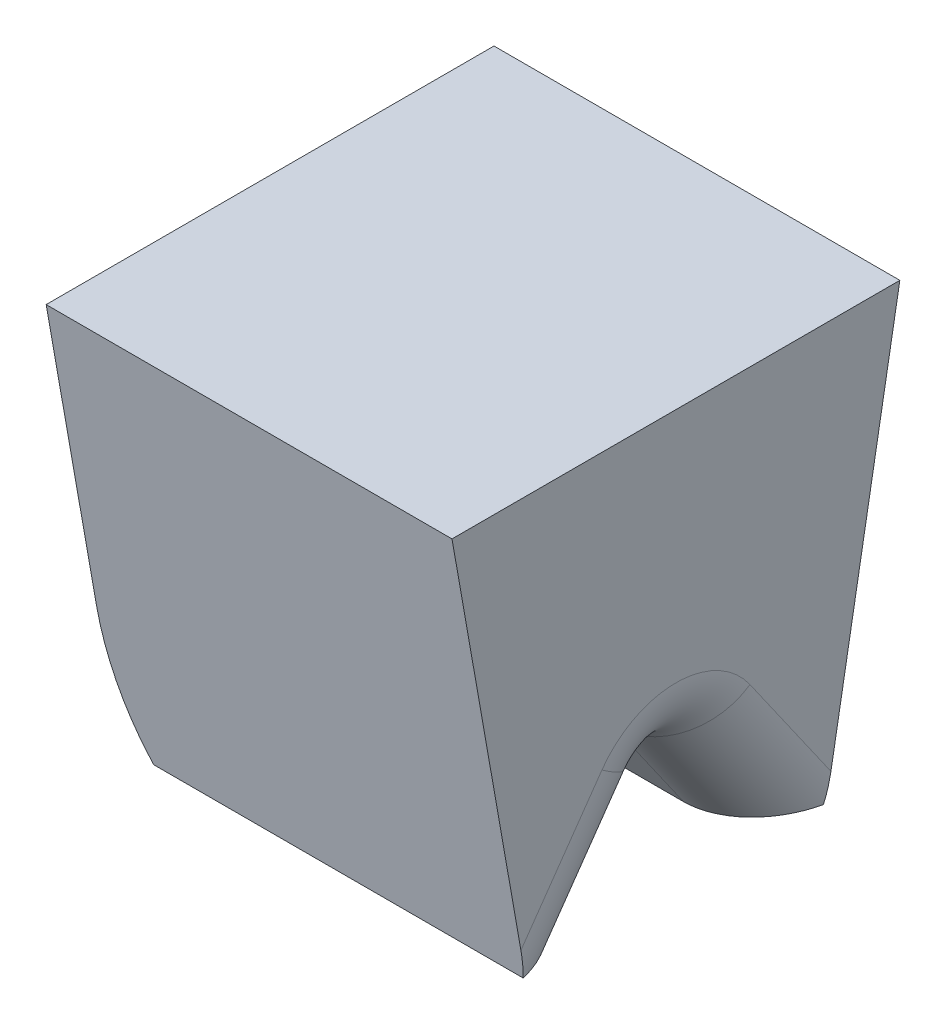
ISO-10303-21;
HEADER;
FILE_DESCRIPTION(('STEP AP214'),'2;1');
FILE_NAME('part.step','',(''),(''),'','','');
FILE_SCHEMA(('AUTOMOTIVE_DESIGN { 1 0 10303 214 1 1 1 1 }'));
ENDSEC;
DATA;
#1=APPLICATION_CONTEXT('core data for automotive mechanical design processes');
#2=APPLICATION_PROTOCOL_DEFINITION('international standard','automotive_design',2000,#1);
#3=PRODUCT_CONTEXT('',#1,'mechanical');
#4=PRODUCT('Part','Part','',(#3));
#5=PRODUCT_RELATED_PRODUCT_CATEGORY('part','',(#4));
#6=PRODUCT_DEFINITION_FORMATION('','',#4);
#7=PRODUCT_DEFINITION_CONTEXT('part definition',#1,'design');
#8=PRODUCT_DEFINITION('design','',#6,#7);
#9=PRODUCT_DEFINITION_SHAPE('','',#8);
#10=(LENGTH_UNIT() NAMED_UNIT(*) SI_UNIT(.MILLI.,.METRE.));
#11=(NAMED_UNIT(*) PLANE_ANGLE_UNIT() SI_UNIT($,.RADIAN.));
#12=(NAMED_UNIT(*) SI_UNIT($,.STERADIAN.) SOLID_ANGLE_UNIT());
#13=UNCERTAINTY_MEASURE_WITH_UNIT(LENGTH_MEASURE(1.E-05),#10,'distance_accuracy_value','');
#14=(GEOMETRIC_REPRESENTATION_CONTEXT(3) GLOBAL_UNCERTAINTY_ASSIGNED_CONTEXT((#13)) GLOBAL_UNIT_ASSIGNED_CONTEXT((#10,
#11,#12)) REPRESENTATION_CONTEXT('',''));
#15=CARTESIAN_POINT('',(0.,0.,0.));
#16=DIRECTION('',(0.,0.,1.));
#17=DIRECTION('',(1.,0.,0.));
#18=AXIS2_PLACEMENT_3D('',#15,#16,#17);
#19=CARTESIAN_POINT('',(0.,0.835526315789467,0.));
#20=DIRECTION('',(0.,1.,0.));
#21=DIRECTION('',(0.,0.,1.));
#22=AXIS2_PLACEMENT_3D('',#19,#20,#21);
#23=PLANE('',#22);
#24=DIRECTION('',(0.,0.,-1.));
#25=VECTOR('',#24,1.);
#26=CARTESIAN_POINT('',(-0.4064,0.835526315789467,1.50859998));
#27=LINE('',#26,#25);
#28=CARTESIAN_POINT('',(-0.4064,0.835526315789467,0.447045832565625));
#29=VERTEX_POINT('',#28);
#30=CARTESIAN_POINT('',(-0.4064,0.835526315789467,-0.447045832565625));
#31=VERTEX_POINT('',#30);
#32=EDGE_CURVE('E142',#29,#31,#27,.T.);
#33=ORIENTED_EDGE('',*,*,#32,.F.);
#34=DIRECTION('',(-1.,0.,0.));
#35=VECTOR('',#34,1.);
#36=CARTESIAN_POINT('',(1.50859998,0.835526315789467,0.447045832565625));
#37=LINE('',#36,#35);
#38=CARTESIAN_POINT('',(0.40386,0.835526315789467,0.447045832565625));
#39=VERTEX_POINT('',#38);
#40=EDGE_CURVE('E57',#39,#29,#37,.T.);
#41=ORIENTED_EDGE('',*,*,#40,.F.);
#42=DIRECTION('',(0.,0.,1.));
#43=VECTOR('',#42,1.);
#44=CARTESIAN_POINT('',(0.40386,0.835526315789467,1.50859998));
#45=LINE('',#44,#43);
#46=CARTESIAN_POINT('',(0.40386,0.835526315789467,-0.447045832565625));
#47=VERTEX_POINT('',#46);
#48=EDGE_CURVE('E12',#47,#39,#45,.T.);
#49=ORIENTED_EDGE('',*,*,#48,.F.);
#50=DIRECTION('',(1.,0.,0.));
#51=VECTOR('',#50,1.);
#52=CARTESIAN_POINT('',(1.50859998,0.835526315789467,-0.447045832565625));
#53=LINE('',#52,#51);
#54=EDGE_CURVE('E129',#31,#47,#53,.T.);
#55=ORIENTED_EDGE('',*,*,#54,.F.);
#56=EDGE_LOOP('',(#33,#41,#49,#55));
#57=FACE_BOUND('',#56,.T.);
#58=ADVANCED_FACE('F42',(#57),#23,.T.);
#59=CARTESIAN_POINT('',(1.50859998,0.,-0.29972));
#60=DIRECTION('',(0.,-0.173648177666931,-0.984807753012208));
#61=DIRECTION('',(0.,0.984807753012208,-0.173648177666931));
#62=AXIS2_PLACEMENT_3D('',#59,#60,#61);
#63=PLANE('',#62);
#64=DIRECTION('',(0.,0.984807753012208,-0.173648177666931));
#65=VECTOR('',#64,1.);
#66=CARTESIAN_POINT('',(-0.4064,0.,-0.29972));
#67=LINE('',#66,#65);
#68=CARTESIAN_POINT('',(-0.4064,0.264032640816543,-0.346276078363664));
#69=VERTEX_POINT('',#68);
#70=EDGE_CURVE('E141',#69,#31,#67,.T.);
#71=ORIENTED_EDGE('',*,*,#70,.T.);
#72=ORIENTED_EDGE('',*,*,#54,.T.);
#73=DIRECTION('',(0.,-0.984807753012208,0.173648177666931));
#74=VECTOR('',#73,1.);
#75=CARTESIAN_POINT('',(0.40386,0.,-0.29972));
#76=LINE('',#75,#74);
#77=CARTESIAN_POINT('',(0.40386,0.0553183507078268,-0.309474117758083));
#78=VERTEX_POINT('',#77);
#79=EDGE_CURVE('E138',#47,#78,#76,.T.);
#80=ORIENTED_EDGE('',*,*,#79,.T.);
#81=CARTESIAN_POINT('',(0.254,0.0553183507078268,-0.309474117758083));
#82=DIRECTION('',(0.,-0.173648177666931,-0.984807753012208));
#83=DIRECTION('',(0.,-0.984807753012208,0.173648177666931));
#84=AXIS2_PLACEMENT_3D('',#81,#82,#83);
#85=ELLIPSE('',#84,0.211934044457232,0.14986);
#86=CARTESIAN_POINT('',(0.398500478306695,0.,-0.29972));
#87=VERTEX_POINT('',#86);
#88=EDGE_CURVE('E250',#78,#87,#85,.T.);
#89=ORIENTED_EDGE('',*,*,#88,.T.);
#90=DIRECTION('',(-1.,0.,0.));
#91=VECTOR('',#90,1.);
#92=CARTESIAN_POINT('',(1.50859998,0.,-0.29972));
#93=LINE('',#92,#91);
#94=CARTESIAN_POINT('',(-0.338825916344483,0.,-0.29972));
#95=VERTEX_POINT('',#94);
#96=EDGE_CURVE('E157',#87,#95,#93,.T.);
#97=ORIENTED_EDGE('',*,*,#96,.T.);
#98=CARTESIAN_POINT('',(-0.10668,0.264032640816543,-0.346276078363664));
#99=DIRECTION('',(0.,-0.173648177666931,-0.984807753012208));
#100=DIRECTION('',(0.,0.984807753012208,-0.173648177666931));
#101=AXIS2_PLACEMENT_3D('',#98,#99,#100);
#102=ELLIPSE('',#101,0.423868088914465,0.29972);
#103=EDGE_CURVE('E243',#95,#69,#102,.T.);
#104=ORIENTED_EDGE('',*,*,#103,.T.);
#105=EDGE_LOOP('',(#71,#72,#80,#89,#97,#104));
#106=FACE_BOUND('',#105,.T.);
#107=ADVANCED_FACE('F137',(#106),#63,.T.);
#108=CARTESIAN_POINT('',(1.50859998,0.,0.29972));
#109=DIRECTION('',(0.,-0.173648177666931,0.984807753012208));
#110=DIRECTION('',(0.,-0.984807753012208,-0.173648177666931));
#111=AXIS2_PLACEMENT_3D('',#108,#109,#110);
#112=PLANE('',#111);
#113=DIRECTION('',(0.,0.984807753012208,0.173648177666931));
#114=VECTOR('',#113,1.);
#115=CARTESIAN_POINT('',(0.40386,0.,0.29972));
#116=LINE('',#115,#114);
#117=CARTESIAN_POINT('',(0.40386,0.0553183507078267,0.309474117758083));
#118=VERTEX_POINT('',#117);
#119=EDGE_CURVE('E148',#118,#39,#116,.T.);
#120=ORIENTED_EDGE('',*,*,#119,.T.);
#121=ORIENTED_EDGE('',*,*,#40,.T.);
#122=DIRECTION('',(0.,-0.984807753012208,-0.173648177666931));
#123=VECTOR('',#122,1.);
#124=CARTESIAN_POINT('',(-0.4064,0.,0.29972));
#125=LINE('',#124,#123);
#126=CARTESIAN_POINT('',(-0.4064,0.264032640816543,0.346276078363664));
#127=VERTEX_POINT('',#126);
#128=EDGE_CURVE('E159',#29,#127,#125,.T.);
#129=ORIENTED_EDGE('',*,*,#128,.T.);
#130=CARTESIAN_POINT('',(-0.10668,0.264032640816543,0.346276078363664));
#131=DIRECTION('',(0.,-0.173648177666931,0.984807753012208));
#132=DIRECTION('',(0.,-0.984807753012208,-0.173648177666931));
#133=AXIS2_PLACEMENT_3D('',#130,#131,#132);
#134=ELLIPSE('',#133,0.423868088914465,0.29972);
#135=CARTESIAN_POINT('',(-0.338825916344483,0.,0.29972));
#136=VERTEX_POINT('',#135);
#137=EDGE_CURVE('E297',#127,#136,#134,.T.);
#138=ORIENTED_EDGE('',*,*,#137,.T.);
#139=DIRECTION('',(-1.,0.,0.));
#140=VECTOR('',#139,1.);
#141=CARTESIAN_POINT('',(1.50859998,0.,0.29972));
#142=LINE('',#141,#140);
#143=CARTESIAN_POINT('',(0.398500478306695,0.,0.29972));
#144=VERTEX_POINT('',#143);
#145=EDGE_CURVE('E150',#144,#136,#142,.T.);
#146=ORIENTED_EDGE('',*,*,#145,.F.);
#147=CARTESIAN_POINT('',(0.254,0.0553183507078267,0.309474117758083));
#148=DIRECTION('',(0.,-0.173648177666931,0.984807753012208));
#149=DIRECTION('',(0.,0.984807753012208,0.173648177666931));
#150=AXIS2_PLACEMENT_3D('',#147,#148,#149);
#151=ELLIPSE('',#150,0.211934044457232,0.14986);
#152=EDGE_CURVE('E261',#144,#118,#151,.T.);
#153=ORIENTED_EDGE('',*,*,#152,.T.);
#154=EDGE_LOOP('',(#120,#121,#129,#138,#146,#153));
#155=FACE_BOUND('',#154,.T.);
#156=ADVANCED_FACE('F212',(#155),#112,.T.);
#157=CARTESIAN_POINT('',(-0.4064,1.08982002,1.50859998));
#158=DIRECTION('',(-1.,0.,0.));
#159=DIRECTION('',(0.,-1.,0.));
#160=AXIS2_PLACEMENT_3D('',#157,#158,#159);
#161=PLANE('',#160);
#162=ORIENTED_EDGE('',*,*,#128,.F.);
#163=ORIENTED_EDGE('',*,*,#32,.T.);
#164=ORIENTED_EDGE('',*,*,#70,.F.);
#165=DIRECTION('',(0.,-0.819152044288993,-0.573576436351044));
#166=VECTOR('',#165,1.);
#167=CARTESIAN_POINT('',(-0.4064,0.372274939283115,-0.270484005024226));
#168=LINE('',#167,#166);
#169=CARTESIAN_POINT('',(-0.4064,0.372274939283115,-0.270484005024226));
#170=VERTEX_POINT('',#169);
#171=EDGE_CURVE('E305',#69,#170,#168,.F.);
#172=ORIENTED_EDGE('',*,*,#171,.T.);
#173=CARTESIAN_POINT('',(-0.4064,0.18288,0.));
#174=DIRECTION('',(-1.,0.,0.));
#175=DIRECTION('',(0.,-1.,0.));
#176=AXIS2_PLACEMENT_3D('',#173,#174,#175);
#177=CIRCLE('',#176,0.3302);
#178=CARTESIAN_POINT('',(-0.4064,0.372274939283115,0.270484005024226));
#179=VERTEX_POINT('',#178);
#180=EDGE_CURVE('E303',#170,#179,#177,.F.);
#181=ORIENTED_EDGE('',*,*,#180,.T.);
#182=DIRECTION('',(0.,0.819152044288993,-0.573576436351044));
#183=VECTOR('',#182,1.);
#184=CARTESIAN_POINT('',(-0.4064,0.171912329503135,0.410779414767537));
#185=LINE('',#184,#183);
#186=EDGE_CURVE('E300',#179,#127,#185,.F.);
#187=ORIENTED_EDGE('',*,*,#186,.T.);
#188=EDGE_LOOP('',(#162,#163,#164,#172,#181,#187));
#189=FACE_BOUND('',#188,.T.);
#190=ADVANCED_FACE('F330',(#189),#161,.T.);
#191=CARTESIAN_POINT('',(0.40386,-0.00999998,1.50859998));
#192=DIRECTION('',(1.,0.,0.));
#193=DIRECTION('',(0.,1.,0.));
#194=AXIS2_PLACEMENT_3D('',#191,#192,#193);
#195=PLANE('',#194);
#196=ORIENTED_EDGE('',*,*,#79,.F.);
#197=ORIENTED_EDGE('',*,*,#48,.T.);
#198=ORIENTED_EDGE('',*,*,#119,.F.);
#199=DIRECTION('',(0.,-0.819152044288993,0.573576436351044));
#200=VECTOR('',#199,1.);
#201=CARTESIAN_POINT('',(0.40386,0.286318774531547,0.147725879667077));
#202=LINE('',#201,#200);
#203=CARTESIAN_POINT('',(0.40386,0.286318774531547,0.147725879667077));
#204=VERTEX_POINT('',#203);
#205=EDGE_CURVE('E247',#118,#204,#202,.F.);
#206=ORIENTED_EDGE('',*,*,#205,.T.);
#207=CARTESIAN_POINT('',(0.40386,0.18288,0.));
#208=DIRECTION('',(1.,0.,0.));
#209=DIRECTION('',(0.,1.,0.));
#210=AXIS2_PLACEMENT_3D('',#207,#208,#209);
#211=CIRCLE('',#210,0.18034);
#212=CARTESIAN_POINT('',(0.40386,0.286318774531547,-0.147725879667077));
#213=VERTEX_POINT('',#212);
#214=EDGE_CURVE('E242',#204,#213,#211,.F.);
#215=ORIENTED_EDGE('',*,*,#214,.T.);
#216=DIRECTION('',(0.,0.819152044288993,0.573576436351044));
#217=VECTOR('',#216,1.);
#218=CARTESIAN_POINT('',(0.40386,0.0859561647515672,-0.288021289410389));
#219=LINE('',#218,#217);
#220=EDGE_CURVE('E146',#213,#78,#219,.F.);
#221=ORIENTED_EDGE('',*,*,#220,.T.);
#222=EDGE_LOOP('',(#196,#197,#198,#206,#215,#221));
#223=FACE_BOUND('',#222,.T.);
#224=ADVANCED_FACE('F144',(#223),#195,.T.);
#225=CARTESIAN_POINT('',(0.,0.,0.));
#226=DIRECTION('',(0.,1.,0.));
#227=DIRECTION('',(0.,0.,1.));
#228=AXIS2_PLACEMENT_3D('',#225,#226,#227);
#229=PLANE('',#228);
#230=ORIENTED_EDGE('',*,*,#96,.F.);
#231=CARTESIAN_POINT('',(0.254,0.,-0.348208443925032));
#232=DIRECTION('',(0.,1.,0.));
#233=DIRECTION('',(0.,0.,-1.));
#234=AXIS2_PLACEMENT_3D('',#231,#232,#233);
#235=ELLIPSE('',#234,0.182945279871791,0.14986);
#236=CARTESIAN_POINT('',(0.254,0.,-0.16526316405324));
#237=VERTEX_POINT('',#236);
#238=EDGE_CURVE('E252',#87,#237,#235,.F.);
#239=ORIENTED_EDGE('',*,*,#238,.T.);
#240=CARTESIAN_POINT('',(0.254,0.,-0.16526316405324));
#241=DIRECTION('',(-1.,0.,0.));
#242=VECTOR('',#241,1.);
#243=LINE('',#240,#242);
#244=CARTESIAN_POINT('',(-0.10668,0.,-0.16526316405324));
#245=VERTEX_POINT('',#244);
#246=EDGE_CURVE('E237',#237,#245,#243,.T.);
#247=ORIENTED_EDGE('',*,*,#246,.T.);
#248=CARTESIAN_POINT('',(-0.10668,0.,-0.531153723796823));
#249=DIRECTION('',(0.,1.,0.));
#250=DIRECTION('',(0.,0.,1.));
#251=AXIS2_PLACEMENT_3D('',#248,#249,#250);
#252=ELLIPSE('',#251,0.365890559743583,0.29972);
#253=EDGE_CURVE('E282',#245,#95,#252,.F.);
#254=ORIENTED_EDGE('',*,*,#253,.T.);
#255=EDGE_LOOP('',(#230,#239,#247,#254));
#256=FACE_BOUND('',#255,.T.);
#257=ADVANCED_FACE('F180',(#256),#229,.F.);
#258=CARTESIAN_POINT('',(-0.10668,0.,0.16526316405324));
#259=DIRECTION('',(1.,0.,0.));
#260=VECTOR('',#259,1.);
#261=LINE('',#258,#260);
#262=CARTESIAN_POINT('',(-0.10668,0.,0.16526316405324));
#263=VERTEX_POINT('',#262);
#264=CARTESIAN_POINT('',(0.254,0.,0.16526316405324));
#265=VERTEX_POINT('',#264);
#266=EDGE_CURVE('E161',#263,#265,#261,.T.);
#267=ORIENTED_EDGE('',*,*,#266,.T.);
#268=CARTESIAN_POINT('',(0.254,0.,0.348208443925032));
#269=DIRECTION('',(0.,1.,0.));
#270=DIRECTION('',(0.,0.,-1.));
#271=AXIS2_PLACEMENT_3D('',#268,#269,#270);
#272=ELLIPSE('',#271,0.182945279871791,0.14986);
#273=EDGE_CURVE('E64',#265,#144,#272,.F.);
#274=ORIENTED_EDGE('',*,*,#273,.T.);
#275=ORIENTED_EDGE('',*,*,#145,.T.);
#276=CARTESIAN_POINT('',(-0.10668,0.,0.531153723796823));
#277=DIRECTION('',(0.,1.,0.));
#278=DIRECTION('',(0.,0.,1.));
#279=AXIS2_PLACEMENT_3D('',#276,#277,#278);
#280=ELLIPSE('',#279,0.365890559743583,0.29972);
#281=EDGE_CURVE('E293',#136,#263,#280,.F.);
#282=ORIENTED_EDGE('',*,*,#281,.T.);
#283=EDGE_LOOP('',(#267,#274,#275,#282));
#284=FACE_BOUND('',#283,.T.);
#285=ADVANCED_FACE('F169',(#284),#229,.F.);
#286=CARTESIAN_POINT('',(-1.20142,0.20036260977998,-0.0249677543099286));
#287=DIRECTION('',(0.,0.573576436351044,-0.819152044288993));
#288=DIRECTION('',(0.,0.819152044288993,0.573576436351044));
#289=AXIS2_PLACEMENT_3D('',#286,#287,#288);
#290=PLANE('',#289);
#291=ORIENTED_EDGE('',*,*,#246,.F.);
#292=DIRECTION('',(0.,0.819152044288993,0.573576436351044));
#293=VECTOR('',#292,1.);
#294=CARTESIAN_POINT('',(0.254,0.20036260977998,-0.0249677543099286));
#295=LINE('',#294,#293);
#296=CARTESIAN_POINT('',(0.254,0.20036260977998,-0.0249677543099286));
#297=VERTEX_POINT('',#296);
#298=EDGE_CURVE('E240',#237,#297,#295,.T.);
#299=ORIENTED_EDGE('',*,*,#298,.T.);
#300=DIRECTION('',(1.,0.,0.));
#301=VECTOR('',#300,1.);
#302=CARTESIAN_POINT('',(-1.20142,0.20036260977998,-0.0249677543099286));
#303=LINE('',#302,#301);
#304=CARTESIAN_POINT('',(-0.10668,0.20036260977998,-0.0249677543099286));
#305=VERTEX_POINT('',#304);
#306=EDGE_CURVE('E279',#305,#297,#303,.T.);
#307=ORIENTED_EDGE('',*,*,#306,.F.);
#308=DIRECTION('',(0.,-0.819152044288993,-0.573576436351044));
#309=VECTOR('',#308,1.);
#310=CARTESIAN_POINT('',(-0.10668,0.,-0.16526316405324));
#311=LINE('',#310,#309);
#312=EDGE_CURVE('E287',#305,#245,#311,.T.);
#313=ORIENTED_EDGE('',*,*,#312,.T.);
#314=EDGE_LOOP('',(#291,#299,#307,#313));
#315=FACE_BOUND('',#314,.T.);
#316=ADVANCED_FACE('F179',(#315),#290,.F.);
#317=CARTESIAN_POINT('',(-1.20142,-0.00999998000000013,0.172265225431187));
#318=DIRECTION('',(0.,0.573576436351044,0.819152044288993));
#319=DIRECTION('',(0.,-0.819152044288993,0.573576436351044));
#320=AXIS2_PLACEMENT_3D('',#317,#318,#319);
#321=PLANE('',#320);
#322=DIRECTION('',(1.,0.,0.));
#323=VECTOR('',#322,1.);
#324=CARTESIAN_POINT('',(-1.20142,0.20036260977998,0.0249677543099286));
#325=LINE('',#324,#323);
#326=CARTESIAN_POINT('',(-0.10668,0.20036260977998,0.0249677543099286));
#327=VERTEX_POINT('',#326);
#328=CARTESIAN_POINT('',(0.254,0.20036260977998,0.0249677543099286));
#329=VERTEX_POINT('',#328);
#330=EDGE_CURVE('E152',#327,#329,#325,.T.);
#331=ORIENTED_EDGE('',*,*,#330,.T.);
#332=DIRECTION('',(0.,-0.819152044288993,0.573576436351044));
#333=VECTOR('',#332,1.);
#334=CARTESIAN_POINT('',(0.254,0.,0.16526316405324));
#335=LINE('',#334,#333);
#336=EDGE_CURVE('E254',#329,#265,#335,.T.);
#337=ORIENTED_EDGE('',*,*,#336,.T.);
#338=ORIENTED_EDGE('',*,*,#266,.F.);
#339=DIRECTION('',(0.,0.819152044288993,-0.573576436351044));
#340=VECTOR('',#339,1.);
#341=CARTESIAN_POINT('',(-0.10668,0.20036260977998,0.0249677543099286));
#342=LINE('',#341,#340);
#343=EDGE_CURVE('E307',#263,#327,#342,.T.);
#344=ORIENTED_EDGE('',*,*,#343,.T.);
#345=EDGE_LOOP('',(#331,#337,#338,#344));
#346=FACE_BOUND('',#345,.T.);
#347=ADVANCED_FACE('F217',(#346),#321,.F.);
#348=CARTESIAN_POINT('',(-1.20142,0.18288,0.));
#349=DIRECTION('',(1.,0.,0.));
#350=DIRECTION('',(0.,0.,-1.));
#351=AXIS2_PLACEMENT_3D('',#348,#349,#350);
#352=CYLINDRICAL_SURFACE('',#351,0.0304800000000002);
#353=ORIENTED_EDGE('',*,*,#306,.T.);
#354=CARTESIAN_POINT('',(0.254,0.18288,0.));
#355=DIRECTION('',(1.,0.,0.));
#356=DIRECTION('',(0.,1.,0.));
#357=AXIS2_PLACEMENT_3D('',#354,#355,#356);
#358=CIRCLE('',#357,0.0304800000000002);
#359=EDGE_CURVE('E50',#297,#329,#358,.T.);
#360=ORIENTED_EDGE('',*,*,#359,.T.);
#361=ORIENTED_EDGE('',*,*,#330,.F.);
#362=CARTESIAN_POINT('',(-0.10668,0.18288,0.));
#363=DIRECTION('',(-1.,0.,0.));
#364=DIRECTION('',(0.,-1.,0.));
#365=AXIS2_PLACEMENT_3D('',#362,#363,#364);
#366=CIRCLE('',#365,0.0304800000000002);
#367=EDGE_CURVE('E291',#327,#305,#366,.T.);
#368=ORIENTED_EDGE('',*,*,#367,.T.);
#369=EDGE_LOOP('',(#353,#360,#361,#368));
#370=FACE_BOUND('',#369,.T.);
#371=ADVANCED_FACE('F194',(#370),#352,.F.);
#372=CARTESIAN_POINT('',(-0.10668,0.372274939283115,-0.270484005024226));
#373=DIRECTION('',(0.,0.819152044288993,0.573576436351044));
#374=DIRECTION('',(0.,-0.573576436351044,0.819152044288993));
#375=AXIS2_PLACEMENT_3D('',#372,#373,#374);
#376=CYLINDRICAL_SURFACE('',#375,0.29972);
#377=ORIENTED_EDGE('',*,*,#253,.F.);
#378=ORIENTED_EDGE('',*,*,#312,.F.);
#379=CARTESIAN_POINT('',(-0.10668,0.372274939283115,-0.270484005024226));
#380=DIRECTION('',(0.,0.819152044288993,0.573576436351045));
#381=DIRECTION('',(0.,-0.573576436351045,0.819152044288993));
#382=AXIS2_PLACEMENT_3D('',#379,#380,#381);
#383=CIRCLE('',#382,0.29972);
#384=EDGE_CURVE('E272',#170,#305,#383,.T.);
#385=ORIENTED_EDGE('',*,*,#384,.F.);
#386=ORIENTED_EDGE('',*,*,#171,.F.);
#387=ORIENTED_EDGE('',*,*,#103,.F.);
#388=EDGE_LOOP('',(#377,#378,#385,#386,#387));
#389=FACE_BOUND('',#388,.T.);
#390=ADVANCED_FACE('F190',(#389),#376,.T.);
#391=CARTESIAN_POINT('',(-0.10668,0.18288,0.));
#392=DIRECTION('',(-1.,0.,0.));
#393=DIRECTION('',(0.,-1.,0.));
#394=AXIS2_PLACEMENT_3D('',#391,#392,#393);
#395=TOROIDAL_SURFACE('',#394,0.3302,0.29972);
#396=ORIENTED_EDGE('',*,*,#384,.T.);
#397=ORIENTED_EDGE('',*,*,#367,.F.);
#398=CARTESIAN_POINT('',(-0.10668,0.372274939283115,0.270484005024226));
#399=DIRECTION('',(0.,-0.819152044288993,0.573576436351044));
#400=DIRECTION('',(0.,-0.573576436351044,-0.819152044288994));
#401=AXIS2_PLACEMENT_3D('',#398,#399,#400);
#402=CIRCLE('',#401,0.29972);
#403=EDGE_CURVE('E268',#179,#327,#402,.T.);
#404=ORIENTED_EDGE('',*,*,#403,.F.);
#405=ORIENTED_EDGE('',*,*,#180,.F.);
#406=EDGE_LOOP('',(#396,#397,#404,#405));
#407=FACE_BOUND('',#406,.T.);
#408=ADVANCED_FACE('F186',(#407),#395,.T.);
#409=CARTESIAN_POINT('',(-0.10668,0.161912349503135,0.417781476145484));
#410=DIRECTION('',(0.,-0.819152044288993,0.573576436351044));
#411=DIRECTION('',(0.,-0.573576436351044,-0.819152044288993));
#412=AXIS2_PLACEMENT_3D('',#409,#410,#411);
#413=CYLINDRICAL_SURFACE('',#412,0.29972);
#414=ORIENTED_EDGE('',*,*,#137,.F.);
#415=ORIENTED_EDGE('',*,*,#186,.F.);
#416=ORIENTED_EDGE('',*,*,#403,.T.);
#417=ORIENTED_EDGE('',*,*,#343,.F.);
#418=ORIENTED_EDGE('',*,*,#281,.F.);
#419=EDGE_LOOP('',(#414,#415,#416,#417,#418));
#420=FACE_BOUND('',#419,.T.);
#421=ADVANCED_FACE('F182',(#420),#413,.T.);
#422=CARTESIAN_POINT('',(0.254,0.0759561847515672,0.295023350788335));
#423=DIRECTION('',(0.,0.819152044288993,-0.573576436351044));
#424=DIRECTION('',(0.,0.573576436351044,0.819152044288993));
#425=AXIS2_PLACEMENT_3D('',#422,#423,#424);
#426=CYLINDRICAL_SURFACE('',#425,0.14986);
#427=ORIENTED_EDGE('',*,*,#273,.F.);
#428=ORIENTED_EDGE('',*,*,#336,.F.);
#429=CARTESIAN_POINT('',(0.254,0.286318774531547,0.147725879667077));
#430=DIRECTION('',(0.,0.819152044288993,-0.573576436351044));
#431=DIRECTION('',(0.,0.573576436351044,0.819152044288994));
#432=AXIS2_PLACEMENT_3D('',#429,#430,#431);
#433=CIRCLE('',#432,0.14986);
#434=EDGE_CURVE('E267',#204,#329,#433,.T.);
#435=ORIENTED_EDGE('',*,*,#434,.F.);
#436=ORIENTED_EDGE('',*,*,#205,.F.);
#437=ORIENTED_EDGE('',*,*,#152,.F.);
#438=EDGE_LOOP('',(#427,#428,#435,#436,#437));
#439=FACE_BOUND('',#438,.T.);
#440=ADVANCED_FACE('F44',(#439),#426,.T.);
#441=CARTESIAN_POINT('',(0.254,0.18288,0.));
#442=DIRECTION('',(1.,0.,0.));
#443=DIRECTION('',(0.,1.,0.));
#444=AXIS2_PLACEMENT_3D('',#441,#442,#443);
#445=TOROIDAL_SURFACE('',#444,0.18034,0.14986);
#446=ORIENTED_EDGE('',*,*,#434,.T.);
#447=ORIENTED_EDGE('',*,*,#359,.F.);
#448=CARTESIAN_POINT('',(0.254,0.286318774531547,-0.147725879667077));
#449=DIRECTION('',(0.,-0.819152044288993,-0.573576436351044));
#450=DIRECTION('',(0.,0.573576436351044,-0.819152044288993));
#451=AXIS2_PLACEMENT_3D('',#448,#449,#450);
#452=CIRCLE('',#451,0.14986);
#453=EDGE_CURVE('E266',#213,#297,#452,.T.);
#454=ORIENTED_EDGE('',*,*,#453,.F.);
#455=ORIENTED_EDGE('',*,*,#214,.F.);
#456=EDGE_LOOP('',(#446,#447,#454,#455));
#457=FACE_BOUND('',#456,.T.);
#458=ADVANCED_FACE('F198',(#457),#445,.T.);
#459=CARTESIAN_POINT('',(0.254,0.286318774531547,-0.147725879667077));
#460=DIRECTION('',(0.,-0.819152044288993,-0.573576436351044));
#461=DIRECTION('',(0.,0.573576436351044,-0.819152044288993));
#462=AXIS2_PLACEMENT_3D('',#459,#460,#461);
#463=CYLINDRICAL_SURFACE('',#462,0.14986);
#464=ORIENTED_EDGE('',*,*,#88,.F.);
#465=ORIENTED_EDGE('',*,*,#220,.F.);
#466=ORIENTED_EDGE('',*,*,#453,.T.);
#467=ORIENTED_EDGE('',*,*,#298,.F.);
#468=ORIENTED_EDGE('',*,*,#238,.F.);
#469=EDGE_LOOP('',(#464,#465,#466,#467,#468));
#470=FACE_BOUND('',#469,.T.);
#471=ADVANCED_FACE('F196',(#470),#463,.T.);
#472=CLOSED_SHELL('',(#58,#107,#156,#190,#224,#257,#285,#316,#347,#371,#390,#408,#421,#440,#458,#471));
#473=MANIFOLD_SOLID_BREP('B2',#472);
#474=ADVANCED_BREP_SHAPE_REPRESENTATION('',(#18,#473),#14);
#475=SHAPE_DEFINITION_REPRESENTATION(#9,#474);
ENDSEC;
END-ISO-10303-21;
